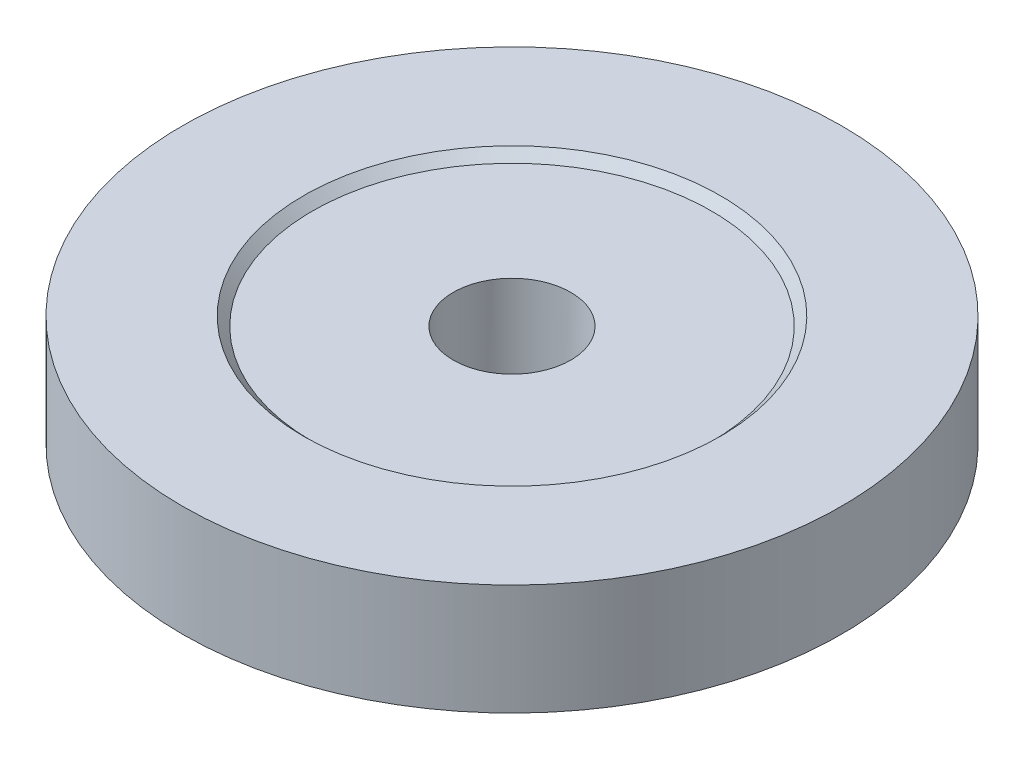
ISO-10303-21;
HEADER;
FILE_DESCRIPTION(('STEP AP214'),'2;1');
FILE_NAME('part.step','',(''),(''),'','','');
FILE_SCHEMA(('AUTOMOTIVE_DESIGN { 1 0 10303 214 1 1 1 1 }'));
ENDSEC;
DATA;
#1=APPLICATION_CONTEXT('core data for automotive mechanical design processes');
#2=APPLICATION_PROTOCOL_DEFINITION('international standard','automotive_design',2000,#1);
#3=PRODUCT_CONTEXT('',#1,'mechanical');
#4=PRODUCT('Part','Part','',(#3));
#5=PRODUCT_RELATED_PRODUCT_CATEGORY('part','',(#4));
#6=PRODUCT_DEFINITION_FORMATION('','',#4);
#7=PRODUCT_DEFINITION_CONTEXT('part definition',#1,'design');
#8=PRODUCT_DEFINITION('design','',#6,#7);
#9=PRODUCT_DEFINITION_SHAPE('','',#8);
#10=(LENGTH_UNIT() NAMED_UNIT(*) SI_UNIT(.MILLI.,.METRE.));
#11=(NAMED_UNIT(*) PLANE_ANGLE_UNIT() SI_UNIT($,.RADIAN.));
#12=(NAMED_UNIT(*) SI_UNIT($,.STERADIAN.) SOLID_ANGLE_UNIT());
#13=UNCERTAINTY_MEASURE_WITH_UNIT(LENGTH_MEASURE(1.E-05),#10,'distance_accuracy_value','');
#14=(GEOMETRIC_REPRESENTATION_CONTEXT(3) GLOBAL_UNCERTAINTY_ASSIGNED_CONTEXT((#13)) GLOBAL_UNIT_ASSIGNED_CONTEXT((#10,
#11,#12)) REPRESENTATION_CONTEXT('',''));
#15=CARTESIAN_POINT('',(0.,0.,0.));
#16=DIRECTION('',(0.,0.,1.));
#17=DIRECTION('',(1.,0.,0.));
#18=AXIS2_PLACEMENT_3D('',#15,#16,#17);
#19=CARTESIAN_POINT('',(-8.22049370600553,2.83352013701569,0.255742586773522));
#20=DIRECTION('',(0.,1.,0.));
#21=DIRECTION('',(0.,0.,1.));
#22=AXIS2_PLACEMENT_3D('',#19,#20,#21);
#23=PLANE('',#22);
#24=CARTESIAN_POINT('',(-8.22049370600553,2.83352013701569,0.255742586773522));
#25=DIRECTION('',(0.,1.,0.));
#26=DIRECTION('',(0.,0.,1.));
#27=AXIS2_PLACEMENT_3D('',#24,#25,#26);
#28=CIRCLE('',#27,18.8722);
#29=CARTESIAN_POINT('',(-8.22049370600553,2.83352013701569,19.1279425867735));
#30=VERTEX_POINT('',#29);
#31=EDGE_CURVE('E38',#30,#30,#28,.T.);
#32=ORIENTED_EDGE('',*,*,#31,.F.);
#33=EDGE_LOOP('',(#32));
#34=FACE_BOUND('',#33,.T.);
#35=CARTESIAN_POINT('',(-8.22049370600553,2.83352013701569,0.255742586773522));
#36=DIRECTION('',(0.,1.,0.));
#37=DIRECTION('',(0.,0.,1.));
#38=AXIS2_PLACEMENT_3D('',#35,#36,#37);
#39=CIRCLE('',#38,11.938);
#40=CARTESIAN_POINT('',(-8.22049370600553,2.83352013701569,12.1937425867735));
#41=VERTEX_POINT('',#40);
#42=EDGE_CURVE('E52',#41,#41,#39,.F.);
#43=ORIENTED_EDGE('',*,*,#42,.F.);
#44=EDGE_LOOP('',(#43));
#45=FACE_BOUND('',#44,.T.);
#46=ADVANCED_FACE('F22',(#34,#45),#23,.F.);
#47=CARTESIAN_POINT('',(-8.22049370600553,9.18352013701569,0.255742586773522));
#48=DIRECTION('',(0.,-1.,0.));
#49=DIRECTION('',(0.,0.,-1.));
#50=AXIS2_PLACEMENT_3D('',#47,#48,#49);
#51=CYLINDRICAL_SURFACE('',#50,18.8722);
#52=CARTESIAN_POINT('',(-8.22049370600553,9.18352013701569,0.255742586773522));
#53=DIRECTION('',(0.,1.,0.));
#54=DIRECTION('',(0.,0.,1.));
#55=AXIS2_PLACEMENT_3D('',#52,#53,#54);
#56=CIRCLE('',#55,18.8722);
#57=CARTESIAN_POINT('',(-8.22049370600553,9.18352013701569,19.1279425867735));
#58=VERTEX_POINT('',#57);
#59=EDGE_CURVE('E31',#58,#58,#56,.T.);
#60=ORIENTED_EDGE('',*,*,#59,.F.);
#61=EDGE_LOOP('',(#60));
#62=FACE_BOUND('',#61,.T.);
#63=ORIENTED_EDGE('',*,*,#31,.T.);
#64=EDGE_LOOP('',(#63));
#65=FACE_BOUND('',#64,.T.);
#66=ADVANCED_FACE('F85',(#62,#65),#51,.T.);
#67=CARTESIAN_POINT('',(-8.22049370600553,9.18352013701569,0.255742586773522));
#68=DIRECTION('',(0.,1.,0.));
#69=DIRECTION('',(0.,0.,1.));
#70=AXIS2_PLACEMENT_3D('',#67,#68,#69);
#71=PLANE('',#70);
#72=CARTESIAN_POINT('',(-8.22049370600553,9.18352013701569,0.255742586773522));
#73=DIRECTION('',(0.,1.,0.));
#74=DIRECTION('',(0.,0.,1.));
#75=AXIS2_PLACEMENT_3D('',#72,#73,#74);
#76=CIRCLE('',#75,11.938);
#77=CARTESIAN_POINT('',(-8.22049370600553,9.18352013701569,12.1937425867735));
#78=VERTEX_POINT('',#77);
#79=EDGE_CURVE('E12',#78,#78,#76,.F.);
#80=ORIENTED_EDGE('',*,*,#79,.T.);
#81=EDGE_LOOP('',(#80));
#82=FACE_BOUND('',#81,.T.);
#83=ORIENTED_EDGE('',*,*,#59,.T.);
#84=EDGE_LOOP('',(#83));
#85=FACE_BOUND('',#84,.T.);
#86=ADVANCED_FACE('F91',(#82,#85),#71,.T.);
#87=CARTESIAN_POINT('',(-8.22049370600553,8.67552013701569,0.255742586773522));
#88=DIRECTION('',(0.,1.,0.));
#89=DIRECTION('',(0.,0.,1.));
#90=AXIS2_PLACEMENT_3D('',#87,#88,#89);
#91=PLANE('',#90);
#92=CARTESIAN_POINT('',(-8.22049370600553,8.67552013701569,0.255742586773522));
#93=DIRECTION('',(0.,1.,0.));
#94=DIRECTION('',(0.,0.,1.));
#95=AXIS2_PLACEMENT_3D('',#92,#93,#94);
#96=CIRCLE('',#95,3.3655);
#97=CARTESIAN_POINT('',(-8.22049370600553,8.67552013701569,3.62124258677352));
#98=VERTEX_POINT('',#97);
#99=EDGE_CURVE('E56',#98,#98,#96,.T.);
#100=ORIENTED_EDGE('',*,*,#99,.F.);
#101=EDGE_LOOP('',(#100));
#102=FACE_BOUND('',#101,.T.);
#103=CARTESIAN_POINT('',(-8.22049370600553,8.67552013701569,0.255742586773522));
#104=DIRECTION('',(0.,1.,0.));
#105=DIRECTION('',(0.,0.,1.));
#106=AXIS2_PLACEMENT_3D('',#103,#104,#105);
#107=CIRCLE('',#106,11.43);
#108=CARTESIAN_POINT('',(-8.22049370600553,8.67552013701569,11.6857425867735));
#109=VERTEX_POINT('',#108);
#110=EDGE_CURVE('E43',#109,#109,#107,.T.);
#111=ORIENTED_EDGE('',*,*,#110,.T.);
#112=EDGE_LOOP('',(#111));
#113=FACE_BOUND('',#112,.T.);
#114=ADVANCED_FACE('F98',(#102,#113),#91,.T.);
#115=CARTESIAN_POINT('',(-8.22049370600553,8.67552013701571,0.255742586773522));
#116=DIRECTION('',(0.,1.,0.));
#117=DIRECTION('',(0.,0.,1.));
#118=AXIS2_PLACEMENT_3D('',#115,#116,#117);
#119=CONICAL_SURFACE('',#118,11.43,0.785398163397452);
#120=ORIENTED_EDGE('',*,*,#79,.F.);
#121=EDGE_LOOP('',(#120));
#122=FACE_BOUND('',#121,.T.);
#123=ORIENTED_EDGE('',*,*,#110,.F.);
#124=EDGE_LOOP('',(#123));
#125=FACE_BOUND('',#124,.T.);
#126=ADVANCED_FACE('F24',(#122,#125),#119,.F.);
#127=CARTESIAN_POINT('',(-8.22049370600553,3.34152013701569,0.255742586773522));
#128=DIRECTION('',(0.,-1.,0.));
#129=DIRECTION('',(0.,0.,1.));
#130=AXIS2_PLACEMENT_3D('',#127,#128,#129);
#131=PLANE('',#130);
#132=CARTESIAN_POINT('',(-8.22049370600553,3.34152013701569,0.255742586773522));
#133=DIRECTION('',(0.,-1.,0.));
#134=DIRECTION('',(0.,0.,-1.));
#135=AXIS2_PLACEMENT_3D('',#132,#133,#134);
#136=CIRCLE('',#135,3.3655);
#137=CARTESIAN_POINT('',(-8.22049370600553,3.34152013701569,-3.10975741322648));
#138=VERTEX_POINT('',#137);
#139=EDGE_CURVE('E26',#138,#138,#136,.T.);
#140=ORIENTED_EDGE('',*,*,#139,.F.);
#141=EDGE_LOOP('',(#140));
#142=FACE_BOUND('',#141,.T.);
#143=CARTESIAN_POINT('',(-8.22049370600553,3.34152013701569,0.255742586773522));
#144=DIRECTION('',(0.,1.,0.));
#145=DIRECTION('',(0.,0.,1.));
#146=AXIS2_PLACEMENT_3D('',#143,#144,#145);
#147=CIRCLE('',#146,11.43);
#148=CARTESIAN_POINT('',(-8.22049370600553,3.34152013701569,11.6857425867735));
#149=VERTEX_POINT('',#148);
#150=EDGE_CURVE('E48',#149,#149,#147,.T.);
#151=ORIENTED_EDGE('',*,*,#150,.F.);
#152=EDGE_LOOP('',(#151));
#153=FACE_BOUND('',#152,.T.);
#154=ADVANCED_FACE('F69',(#142,#153),#131,.T.);
#155=CARTESIAN_POINT('',(-8.22049370600553,3.34152013701567,0.255742586773522));
#156=DIRECTION('',(0.,-1.,0.));
#157=DIRECTION('',(0.,0.,1.));
#158=AXIS2_PLACEMENT_3D('',#155,#156,#157);
#159=CONICAL_SURFACE('',#158,11.43,0.785398163397452);
#160=ORIENTED_EDGE('',*,*,#42,.T.);
#161=EDGE_LOOP('',(#160));
#162=FACE_BOUND('',#161,.T.);
#163=ORIENTED_EDGE('',*,*,#150,.T.);
#164=EDGE_LOOP('',(#163));
#165=FACE_BOUND('',#164,.T.);
#166=ADVANCED_FACE('F72',(#162,#165),#159,.F.);
#167=CARTESIAN_POINT('',(-8.22049370600553,2.83352013701569,0.255742586773522));
#168=DIRECTION('',(0.,1.,0.));
#169=DIRECTION('',(0.,0.,1.));
#170=AXIS2_PLACEMENT_3D('',#167,#168,#169);
#171=CYLINDRICAL_SURFACE('',#170,3.3655);
#172=ORIENTED_EDGE('',*,*,#139,.T.);
#173=EDGE_LOOP('',(#172));
#174=FACE_BOUND('',#173,.T.);
#175=ORIENTED_EDGE('',*,*,#99,.T.);
#176=EDGE_LOOP('',(#175));
#177=FACE_BOUND('',#176,.T.);
#178=ADVANCED_FACE('F67',(#174,#177),#171,.F.);
#179=CLOSED_SHELL('',(#46,#66,#86,#114,#126,#154,#166,#178));
#180=MANIFOLD_SOLID_BREP('B1',#179);
#181=ADVANCED_BREP_SHAPE_REPRESENTATION('',(#18,#180),#14);
#182=SHAPE_DEFINITION_REPRESENTATION(#9,#181);
ENDSEC;
END-ISO-10303-21;
